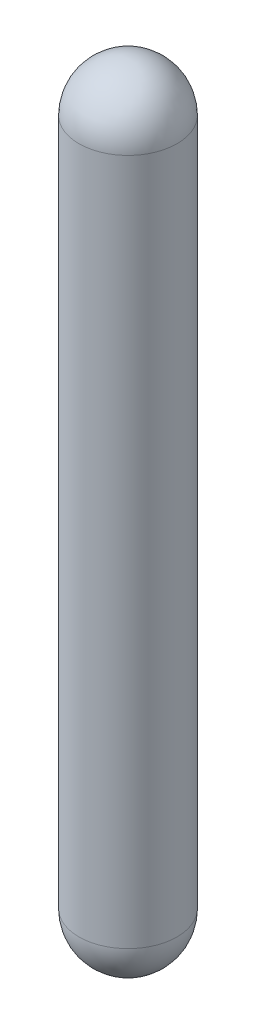
ISO-10303-21;
HEADER;
FILE_DESCRIPTION(('STEP AP214'),'2;1');
FILE_NAME('part.step','',(''),(''),'','','');
FILE_SCHEMA(('AUTOMOTIVE_DESIGN { 1 0 10303 214 1 1 1 1 }'));
ENDSEC;
DATA;
#1=APPLICATION_CONTEXT('core data for automotive mechanical design processes');
#2=APPLICATION_PROTOCOL_DEFINITION('international standard','automotive_design',2000,#1);
#3=PRODUCT_CONTEXT('',#1,'mechanical');
#4=PRODUCT('Part','Part','',(#3));
#5=PRODUCT_RELATED_PRODUCT_CATEGORY('part','',(#4));
#6=PRODUCT_DEFINITION_FORMATION('','',#4);
#7=PRODUCT_DEFINITION_CONTEXT('part definition',#1,'design');
#8=PRODUCT_DEFINITION('design','',#6,#7);
#9=PRODUCT_DEFINITION_SHAPE('','',#8);
#10=(LENGTH_UNIT() NAMED_UNIT(*) SI_UNIT(.MILLI.,.METRE.));
#11=(NAMED_UNIT(*) PLANE_ANGLE_UNIT() SI_UNIT($,.RADIAN.));
#12=(NAMED_UNIT(*) SI_UNIT($,.STERADIAN.) SOLID_ANGLE_UNIT());
#13=UNCERTAINTY_MEASURE_WITH_UNIT(LENGTH_MEASURE(1.E-05),#10,'distance_accuracy_value','');
#14=(GEOMETRIC_REPRESENTATION_CONTEXT(3) GLOBAL_UNCERTAINTY_ASSIGNED_CONTEXT((#13)) GLOBAL_UNIT_ASSIGNED_CONTEXT((#10,
#11,#12)) REPRESENTATION_CONTEXT('',''));
#15=CARTESIAN_POINT('',(0.,0.,0.));
#16=DIRECTION('',(0.,0.,1.));
#17=DIRECTION('',(1.,0.,0.));
#18=AXIS2_PLACEMENT_3D('',#15,#16,#17);
#19=CARTESIAN_POINT('',(0.,25.4,0.));
#20=DIRECTION('',(0.,-1.,0.));
#21=DIRECTION('',(0.,0.,-1.));
#22=AXIS2_PLACEMENT_3D('',#19,#20,#21);
#23=CYLINDRICAL_SURFACE('',#22,3.175);
#24=CARTESIAN_POINT('',(0.,-22.225,0.));
#25=DIRECTION('',(0.,-1.,0.));
#26=DIRECTION('',(0.,0.,-1.));
#27=AXIS2_PLACEMENT_3D('',#24,#25,#26);
#28=CIRCLE('',#27,3.175);
#29=CARTESIAN_POINT('',(0.,-22.225,-3.175));
#30=VERTEX_POINT('',#29);
#31=EDGE_CURVE('E10',#30,#30,#28,.F.);
#32=ORIENTED_EDGE('',*,*,#31,.T.);
#33=EDGE_LOOP('',(#32));
#34=FACE_BOUND('',#33,.T.);
#35=CARTESIAN_POINT('',(0.,22.225,0.));
#36=DIRECTION('',(0.,-1.,0.));
#37=DIRECTION('',(0.,0.,-1.));
#38=AXIS2_PLACEMENT_3D('',#35,#36,#37);
#39=CIRCLE('',#38,3.175);
#40=CARTESIAN_POINT('',(0.,22.225,-3.175));
#41=VERTEX_POINT('',#40);
#42=EDGE_CURVE('E38',#41,#41,#39,.T.);
#43=ORIENTED_EDGE('',*,*,#42,.T.);
#44=EDGE_LOOP('',(#43));
#45=FACE_BOUND('',#44,.T.);
#46=ADVANCED_FACE('F31',(#34,#45),#23,.T.);
#47=CARTESIAN_POINT('',(0.,-22.225,0.));
#48=DIRECTION('',(0.,1.,0.));
#49=DIRECTION('',(0.,0.,1.));
#50=AXIS2_PLACEMENT_3D('',#47,#48,#49);
#51=SPHERICAL_SURFACE('',#50,3.175);
#52=ORIENTED_EDGE('',*,*,#31,.F.);
#53=EDGE_LOOP('',(#52));
#54=FACE_BOUND('',#53,.T.);
#55=ADVANCED_FACE('F46',(#54),#51,.T.);
#56=CARTESIAN_POINT('',(0.,22.225,0.));
#57=DIRECTION('',(0.,1.,0.));
#58=DIRECTION('',(0.,0.,1.));
#59=AXIS2_PLACEMENT_3D('',#56,#57,#58);
#60=SPHERICAL_SURFACE('',#59,3.175);
#61=ORIENTED_EDGE('',*,*,#42,.F.);
#62=EDGE_LOOP('',(#61));
#63=FACE_BOUND('',#62,.T.);
#64=ADVANCED_FACE('F33',(#63),#60,.T.);
#65=CLOSED_SHELL('',(#46,#55,#64));
#66=MANIFOLD_SOLID_BREP('B2',#65);
#67=ADVANCED_BREP_SHAPE_REPRESENTATION('',(#18,#66),#14);
#68=SHAPE_DEFINITION_REPRESENTATION(#9,#67);
ENDSEC;
END-ISO-10303-21;
